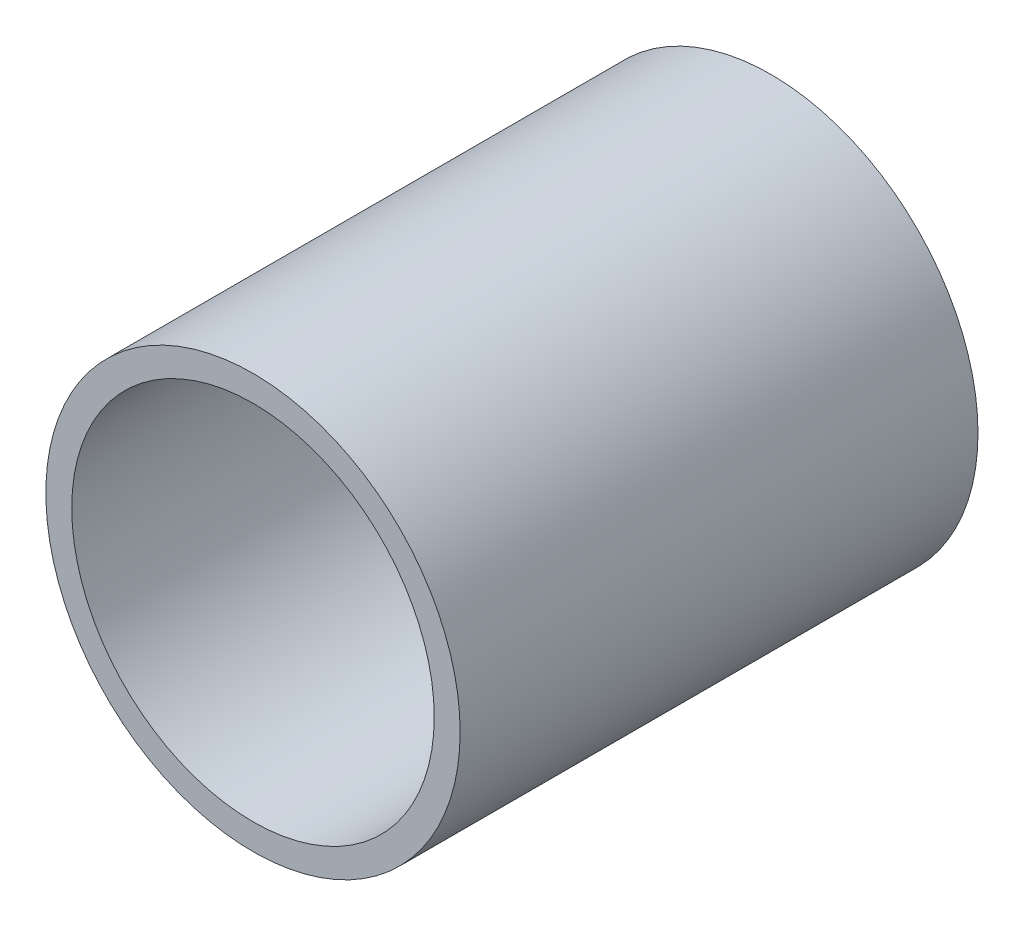
ISO-10303-21;
HEADER;
FILE_DESCRIPTION(('STEP AP214'),'2;1');
FILE_NAME('part.step','',(''),(''),'','','');
FILE_SCHEMA(('AUTOMOTIVE_DESIGN { 1 0 10303 214 1 1 1 1 }'));
ENDSEC;
DATA;
#1=APPLICATION_CONTEXT('core data for automotive mechanical design processes');
#2=APPLICATION_PROTOCOL_DEFINITION('international standard','automotive_design',2000,#1);
#3=PRODUCT_CONTEXT('',#1,'mechanical');
#4=PRODUCT('Part','Part','',(#3));
#5=PRODUCT_RELATED_PRODUCT_CATEGORY('part','',(#4));
#6=PRODUCT_DEFINITION_FORMATION('','',#4);
#7=PRODUCT_DEFINITION_CONTEXT('part definition',#1,'design');
#8=PRODUCT_DEFINITION('design','',#6,#7);
#9=PRODUCT_DEFINITION_SHAPE('','',#8);
#10=(LENGTH_UNIT() NAMED_UNIT(*) SI_UNIT(.MILLI.,.METRE.));
#11=(NAMED_UNIT(*) PLANE_ANGLE_UNIT() SI_UNIT($,.RADIAN.));
#12=(NAMED_UNIT(*) SI_UNIT($,.STERADIAN.) SOLID_ANGLE_UNIT());
#13=UNCERTAINTY_MEASURE_WITH_UNIT(LENGTH_MEASURE(1.E-05),#10,'distance_accuracy_value','');
#14=(GEOMETRIC_REPRESENTATION_CONTEXT(3) GLOBAL_UNCERTAINTY_ASSIGNED_CONTEXT((#13)) GLOBAL_UNIT_ASSIGNED_CONTEXT((#10,
#11,#12)) REPRESENTATION_CONTEXT('',''));
#15=CARTESIAN_POINT('',(0.,0.,0.));
#16=DIRECTION('',(0.,0.,1.));
#17=DIRECTION('',(1.,0.,0.));
#18=AXIS2_PLACEMENT_3D('',#15,#16,#17);
#19=CARTESIAN_POINT('',(0.,0.,10.));
#20=DIRECTION('',(0.,0.,1.));
#21=DIRECTION('',(1.,0.,0.));
#22=AXIS2_PLACEMENT_3D('',#19,#20,#21);
#23=PLANE('',#22);
#24=CARTESIAN_POINT('',(0.,0.,10.));
#25=DIRECTION('',(0.,0.,1.));
#26=DIRECTION('',(1.,0.,0.));
#27=AXIS2_PLACEMENT_3D('',#24,#25,#26);
#28=CIRCLE('',#27,4.);
#29=CARTESIAN_POINT('',(4.,0.,10.));
#30=VERTEX_POINT('',#29);
#31=EDGE_CURVE('E10',#30,#30,#28,.T.);
#32=ORIENTED_EDGE('',*,*,#31,.T.);
#33=EDGE_LOOP('',(#32));
#34=FACE_BOUND('',#33,.T.);
#35=CARTESIAN_POINT('',(0.,0.,10.));
#36=DIRECTION('',(0.,0.,1.));
#37=DIRECTION('',(1.,0.,0.));
#38=AXIS2_PLACEMENT_3D('',#35,#36,#37);
#39=CIRCLE('',#38,3.5);
#40=CARTESIAN_POINT('',(3.5,0.,10.));
#41=VERTEX_POINT('',#40);
#42=EDGE_CURVE('E50',#41,#41,#39,.T.);
#43=ORIENTED_EDGE('',*,*,#42,.F.);
#44=EDGE_LOOP('',(#43));
#45=FACE_BOUND('',#44,.T.);
#46=ADVANCED_FACE('F37',(#34,#45),#23,.T.);
#47=CARTESIAN_POINT('',(0.,0.,0.));
#48=DIRECTION('',(0.,0.,1.));
#49=DIRECTION('',(1.,0.,0.));
#50=AXIS2_PLACEMENT_3D('',#47,#48,#49);
#51=PLANE('',#50);
#52=CARTESIAN_POINT('',(0.,0.,0.));
#53=DIRECTION('',(0.,0.,1.));
#54=DIRECTION('',(1.,0.,0.));
#55=AXIS2_PLACEMENT_3D('',#52,#53,#54);
#56=CIRCLE('',#55,4.);
#57=CARTESIAN_POINT('',(4.,0.,0.));
#58=VERTEX_POINT('',#57);
#59=EDGE_CURVE('E41',#58,#58,#56,.T.);
#60=ORIENTED_EDGE('',*,*,#59,.F.);
#61=EDGE_LOOP('',(#60));
#62=FACE_BOUND('',#61,.T.);
#63=CARTESIAN_POINT('',(0.,0.,0.));
#64=DIRECTION('',(0.,0.,1.));
#65=DIRECTION('',(1.,0.,0.));
#66=AXIS2_PLACEMENT_3D('',#63,#64,#65);
#67=CIRCLE('',#66,3.5);
#68=CARTESIAN_POINT('',(3.5,0.,0.));
#69=VERTEX_POINT('',#68);
#70=EDGE_CURVE('E52',#69,#69,#67,.T.);
#71=ORIENTED_EDGE('',*,*,#70,.T.);
#72=EDGE_LOOP('',(#71));
#73=FACE_BOUND('',#72,.T.);
#74=ADVANCED_FACE('F64',(#62,#73),#51,.F.);
#75=CARTESIAN_POINT('',(0.,0.,10.));
#76=DIRECTION('',(0.,0.,-1.));
#77=DIRECTION('',(-1.,0.,0.));
#78=AXIS2_PLACEMENT_3D('',#75,#76,#77);
#79=CYLINDRICAL_SURFACE('',#78,4.);
#80=ORIENTED_EDGE('',*,*,#31,.F.);
#81=EDGE_LOOP('',(#80));
#82=FACE_BOUND('',#81,.T.);
#83=ORIENTED_EDGE('',*,*,#59,.T.);
#84=EDGE_LOOP('',(#83));
#85=FACE_BOUND('',#84,.T.);
#86=ADVANCED_FACE('F39',(#82,#85),#79,.T.);
#87=CARTESIAN_POINT('',(0.,0.,10.));
#88=DIRECTION('',(0.,0.,-1.));
#89=DIRECTION('',(-1.,0.,0.));
#90=AXIS2_PLACEMENT_3D('',#87,#88,#89);
#91=CYLINDRICAL_SURFACE('',#90,3.5);
#92=ORIENTED_EDGE('',*,*,#42,.T.);
#93=EDGE_LOOP('',(#92));
#94=FACE_BOUND('',#93,.T.);
#95=ORIENTED_EDGE('',*,*,#70,.F.);
#96=EDGE_LOOP('',(#95));
#97=FACE_BOUND('',#96,.T.);
#98=ADVANCED_FACE('F60',(#94,#97),#91,.F.);
#99=CLOSED_SHELL('',(#46,#74,#86,#98));
#100=MANIFOLD_SOLID_BREP('B2',#99);
#101=ADVANCED_BREP_SHAPE_REPRESENTATION('',(#18,#100),#14);
#102=SHAPE_DEFINITION_REPRESENTATION(#9,#101);
ENDSEC;
END-ISO-10303-21;
